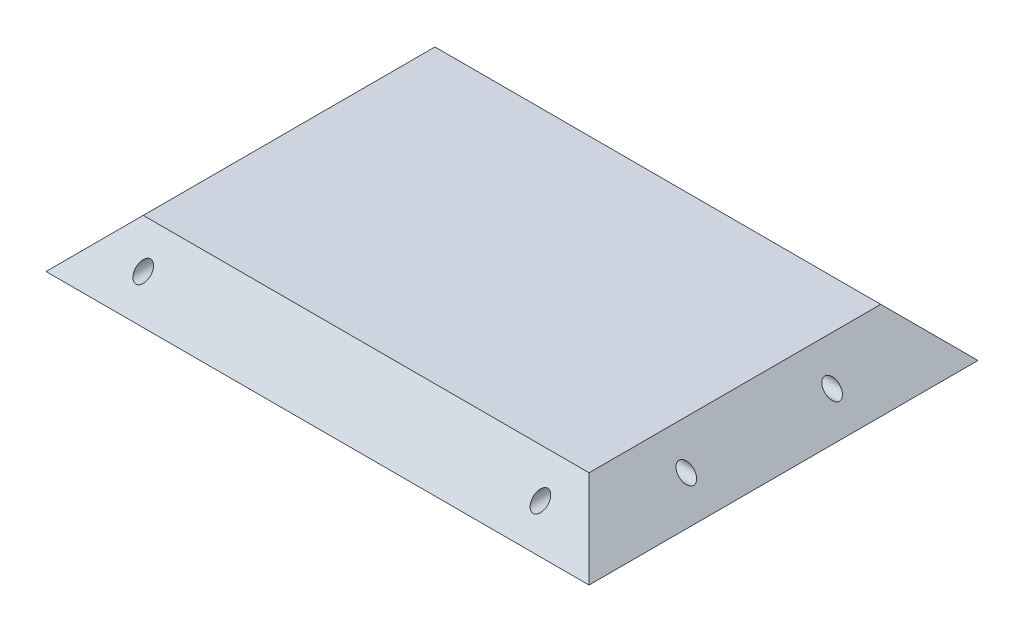
ISO-10303-21;
HEADER;
FILE_DESCRIPTION(('STEP AP214'),'2;1');
FILE_NAME('part.step','',(''),(''),'','','');
FILE_SCHEMA(('AUTOMOTIVE_DESIGN { 1 0 10303 214 1 1 1 1 }'));
ENDSEC;
DATA;
#1=APPLICATION_CONTEXT('core data for automotive mechanical design processes');
#2=APPLICATION_PROTOCOL_DEFINITION('international standard','automotive_design',2000,#1);
#3=PRODUCT_CONTEXT('',#1,'mechanical');
#4=PRODUCT('Part','Part','',(#3));
#5=PRODUCT_RELATED_PRODUCT_CATEGORY('part','',(#4));
#6=PRODUCT_DEFINITION_FORMATION('','',#4);
#7=PRODUCT_DEFINITION_CONTEXT('part definition',#1,'design');
#8=PRODUCT_DEFINITION('design','',#6,#7);
#9=PRODUCT_DEFINITION_SHAPE('','',#8);
#10=(LENGTH_UNIT() NAMED_UNIT(*) SI_UNIT(.MILLI.,.METRE.));
#11=(NAMED_UNIT(*) PLANE_ANGLE_UNIT() SI_UNIT($,.RADIAN.));
#12=(NAMED_UNIT(*) SI_UNIT($,.STERADIAN.) SOLID_ANGLE_UNIT());
#13=UNCERTAINTY_MEASURE_WITH_UNIT(LENGTH_MEASURE(1.E-05),#10,'distance_accuracy_value','');
#14=(GEOMETRIC_REPRESENTATION_CONTEXT(3) GLOBAL_UNCERTAINTY_ASSIGNED_CONTEXT((#13)) GLOBAL_UNIT_ASSIGNED_CONTEXT((#10,
#11,#12)) REPRESENTATION_CONTEXT('',''));
#15=CARTESIAN_POINT('',(0.,0.,0.));
#16=DIRECTION('',(0.,0.,1.));
#17=DIRECTION('',(1.,0.,0.));
#18=AXIS2_PLACEMENT_3D('',#15,#16,#17);
#19=CARTESIAN_POINT('',(-27.925,27.925,0.));
#20=DIRECTION('',(0.707106781186547,-0.707106781186547,0.));
#21=DIRECTION('',(0.707106781186548,0.707106781186547,0.));
#22=AXIS2_PLACEMENT_3D('',#19,#20,#21);
#23=PLANE('',#22);
#24=DIRECTION('',(0.577350269189626,0.577350269189626,-0.577350269189626));
#25=VECTOR('',#24,1.);
#26=CARTESIAN_POINT('',(-55.85,0.,40.));
#27=LINE('',#26,#25);
#28=CARTESIAN_POINT('',(-55.85,0.,40.));
#29=VERTEX_POINT('',#28);
#30=CARTESIAN_POINT('',(-45.85,10.,30.));
#31=VERTEX_POINT('',#30);
#32=EDGE_CURVE('E307',#29,#31,#27,.T.);
#33=ORIENTED_EDGE('',*,*,#32,.T.);
#34=DIRECTION('',(0.,0.,1.));
#35=VECTOR('',#34,1.);
#36=CARTESIAN_POINT('',(-45.85,10.,-30.));
#37=LINE('',#36,#35);
#38=CARTESIAN_POINT('',(-45.85,10.,-30.));
#39=VERTEX_POINT('',#38);
#40=EDGE_CURVE('E57',#39,#31,#37,.T.);
#41=ORIENTED_EDGE('',*,*,#40,.F.);
#42=DIRECTION('',(0.577350269189626,0.577350269189626,0.577350269189626));
#43=VECTOR('',#42,1.);
#44=CARTESIAN_POINT('',(-55.85,0.,-40.));
#45=LINE('',#44,#43);
#46=CARTESIAN_POINT('',(-55.85,0.,-40.));
#47=VERTEX_POINT('',#46);
#48=EDGE_CURVE('E394',#47,#39,#45,.T.);
#49=ORIENTED_EDGE('',*,*,#48,.F.);
#50=DIRECTION('',(0.,0.,1.));
#51=VECTOR('',#50,1.);
#52=CARTESIAN_POINT('',(-55.85,0.,40.));
#53=LINE('',#52,#51);
#54=EDGE_CURVE('E391',#47,#29,#53,.T.);
#55=ORIENTED_EDGE('',*,*,#54,.T.);
#56=EDGE_LOOP('',(#33,#41,#49,#55));
#57=FACE_BOUND('',#56,.T.);
#58=CARTESIAN_POINT('',(-50.85,5.,15.));
#59=DIRECTION('',(0.707106781186547,-0.707106781186547,0.));
#60=DIRECTION('',(-0.707106781186548,-0.707106781186547,0.));
#61=AXIS2_PLACEMENT_3D('',#58,#59,#60);
#62=ELLIPSE('',#61,2.12132034355964,1.5);
#63=CARTESIAN_POINT('',(-52.35,3.5,15.));
#64=VERTEX_POINT('',#63);
#65=EDGE_CURVE('E270',#64,#64,#62,.F.);
#66=ORIENTED_EDGE('',*,*,#65,.F.);
#67=EDGE_LOOP('',(#66));
#68=FACE_BOUND('',#67,.T.);
#69=CARTESIAN_POINT('',(-50.85,5.,-15.));
#70=DIRECTION('',(0.707106781186547,-0.707106781186547,0.));
#71=DIRECTION('',(-0.707106781186548,-0.707106781186547,0.));
#72=AXIS2_PLACEMENT_3D('',#69,#70,#71);
#73=ELLIPSE('',#72,2.12132034355964,1.5);
#74=CARTESIAN_POINT('',(-52.35,3.5,-15.));
#75=VERTEX_POINT('',#74);
#76=EDGE_CURVE('E52',#75,#75,#73,.T.);
#77=ORIENTED_EDGE('',*,*,#76,.T.);
#78=EDGE_LOOP('',(#77));
#79=FACE_BOUND('',#78,.T.);
#80=ADVANCED_FACE('F47',(#57,#68,#79),#23,.F.);
#81=CARTESIAN_POINT('',(27.925,27.925,0.));
#82=DIRECTION('',(-0.707106781186547,-0.707106781186547,0.));
#83=DIRECTION('',(0.707106781186548,-0.707106781186547,0.));
#84=AXIS2_PLACEMENT_3D('',#81,#82,#83);
#85=PLANE('',#84);
#86=CARTESIAN_POINT('',(50.85,5.,15.));
#87=DIRECTION('',(-0.707106781186547,-0.707106781186547,0.));
#88=DIRECTION('',(0.707106781186548,-0.707106781186547,0.));
#89=AXIS2_PLACEMENT_3D('',#86,#87,#88);
#90=ELLIPSE('',#89,2.12132034355964,1.5);
#91=CARTESIAN_POINT('',(52.35,3.5,15.));
#92=VERTEX_POINT('',#91);
#93=EDGE_CURVE('E276',#92,#92,#90,.T.);
#94=ORIENTED_EDGE('',*,*,#93,.T.);
#95=EDGE_LOOP('',(#94));
#96=FACE_BOUND('',#95,.T.);
#97=DIRECTION('',(-0.577350269189626,0.577350269189626,0.577350269189626));
#98=VECTOR('',#97,1.);
#99=CARTESIAN_POINT('',(55.85,0.,-40.));
#100=LINE('',#99,#98);
#101=CARTESIAN_POINT('',(55.85,0.,-40.));
#102=VERTEX_POINT('',#101);
#103=CARTESIAN_POINT('',(45.85,10.,-30.));
#104=VERTEX_POINT('',#103);
#105=EDGE_CURVE('E410',#102,#104,#100,.T.);
#106=ORIENTED_EDGE('',*,*,#105,.T.);
#107=DIRECTION('',(0.,0.,-1.));
#108=VECTOR('',#107,1.);
#109=CARTESIAN_POINT('',(45.85,10.,30.));
#110=LINE('',#109,#108);
#111=CARTESIAN_POINT('',(45.85,10.,30.));
#112=VERTEX_POINT('',#111);
#113=EDGE_CURVE('E338',#112,#104,#110,.T.);
#114=ORIENTED_EDGE('',*,*,#113,.F.);
#115=DIRECTION('',(-0.577350269189626,0.577350269189626,-0.577350269189626));
#116=VECTOR('',#115,1.);
#117=CARTESIAN_POINT('',(55.85,0.,40.));
#118=LINE('',#117,#116);
#119=CARTESIAN_POINT('',(55.85,0.,40.));
#120=VERTEX_POINT('',#119);
#121=EDGE_CURVE('E396',#120,#112,#118,.T.);
#122=ORIENTED_EDGE('',*,*,#121,.F.);
#123=DIRECTION('',(0.,0.,-1.));
#124=VECTOR('',#123,1.);
#125=CARTESIAN_POINT('',(55.85,0.,40.));
#126=LINE('',#125,#124);
#127=EDGE_CURVE('E422',#120,#102,#126,.T.);
#128=ORIENTED_EDGE('',*,*,#127,.T.);
#129=EDGE_LOOP('',(#106,#114,#122,#128));
#130=FACE_BOUND('',#129,.T.);
#131=CARTESIAN_POINT('',(50.85,5.,-15.));
#132=DIRECTION('',(-0.707106781186547,-0.707106781186547,0.));
#133=DIRECTION('',(0.707106781186548,-0.707106781186547,0.));
#134=AXIS2_PLACEMENT_3D('',#131,#132,#133);
#135=ELLIPSE('',#134,2.12132034355964,1.5);
#136=CARTESIAN_POINT('',(52.35,3.5,-15.));
#137=VERTEX_POINT('',#136);
#138=EDGE_CURVE('E287',#137,#137,#135,.F.);
#139=ORIENTED_EDGE('',*,*,#138,.F.);
#140=EDGE_LOOP('',(#139));
#141=FACE_BOUND('',#140,.T.);
#142=ADVANCED_FACE('F321',(#96,#130,#141),#85,.F.);
#143=CARTESIAN_POINT('',(0.,20.,-20.));
#144=DIRECTION('',(0.,-0.707106781186547,0.707106781186547));
#145=DIRECTION('',(0.,-0.707106781186547,-0.707106781186548));
#146=AXIS2_PLACEMENT_3D('',#143,#144,#145);
#147=PLANE('',#146);
#148=CARTESIAN_POINT('',(-40.85,4.99999999999999,-35.));
#149=DIRECTION('',(0.,-0.707106781186547,0.707106781186547));
#150=DIRECTION('',(0.,-0.707106781186547,-0.707106781186548));
#151=AXIS2_PLACEMENT_3D('',#148,#149,#150);
#152=ELLIPSE('',#151,2.12132034355965,1.5);
#153=CARTESIAN_POINT('',(-40.85,3.49999999999999,-36.5));
#154=VERTEX_POINT('',#153);
#155=EDGE_CURVE('E283',#154,#154,#152,.T.);
#156=ORIENTED_EDGE('',*,*,#155,.T.);
#157=EDGE_LOOP('',(#156));
#158=FACE_BOUND('',#157,.T.);
#159=ORIENTED_EDGE('',*,*,#48,.T.);
#160=DIRECTION('',(-1.,0.,0.));
#161=VECTOR('',#160,1.);
#162=CARTESIAN_POINT('',(45.85,10.,-30.));
#163=LINE('',#162,#161);
#164=EDGE_CURVE('E352',#104,#39,#163,.T.);
#165=ORIENTED_EDGE('',*,*,#164,.F.);
#166=ORIENTED_EDGE('',*,*,#105,.F.);
#167=DIRECTION('',(-1.,0.,0.));
#168=VECTOR('',#167,1.);
#169=CARTESIAN_POINT('',(-55.85,0.,-40.));
#170=LINE('',#169,#168);
#171=EDGE_CURVE('E407',#102,#47,#170,.T.);
#172=ORIENTED_EDGE('',*,*,#171,.T.);
#173=EDGE_LOOP('',(#159,#165,#166,#172));
#174=FACE_BOUND('',#173,.T.);
#175=CARTESIAN_POINT('',(40.85,5.,-35.));
#176=DIRECTION('',(0.,-0.707106781186547,0.707106781186547));
#177=DIRECTION('',(0.,-0.707106781186547,-0.707106781186548));
#178=AXIS2_PLACEMENT_3D('',#175,#176,#177);
#179=ELLIPSE('',#178,2.12132034355965,1.5);
#180=CARTESIAN_POINT('',(40.85,3.5,-36.5));
#181=VERTEX_POINT('',#180);
#182=EDGE_CURVE('E295',#181,#181,#179,.F.);
#183=ORIENTED_EDGE('',*,*,#182,.F.);
#184=EDGE_LOOP('',(#183));
#185=FACE_BOUND('',#184,.T.);
#186=ADVANCED_FACE('F318',(#158,#174,#185),#147,.F.);
#187=CARTESIAN_POINT('',(0.,20.,20.));
#188=DIRECTION('',(0.,-0.707106781186547,-0.707106781186547));
#189=DIRECTION('',(0.,0.707106781186547,-0.707106781186548));
#190=AXIS2_PLACEMENT_3D('',#187,#188,#189);
#191=PLANE('',#190);
#192=ORIENTED_EDGE('',*,*,#121,.T.);
#193=DIRECTION('',(1.,0.,0.));
#194=VECTOR('',#193,1.);
#195=CARTESIAN_POINT('',(-45.85,10.,30.));
#196=LINE('',#195,#194);
#197=EDGE_CURVE('E12',#31,#112,#196,.T.);
#198=ORIENTED_EDGE('',*,*,#197,.F.);
#199=ORIENTED_EDGE('',*,*,#32,.F.);
#200=DIRECTION('',(1.,0.,0.));
#201=VECTOR('',#200,1.);
#202=CARTESIAN_POINT('',(-55.85,0.,40.));
#203=LINE('',#202,#201);
#204=EDGE_CURVE('E301',#29,#120,#203,.T.);
#205=ORIENTED_EDGE('',*,*,#204,.T.);
#206=EDGE_LOOP('',(#192,#198,#199,#205));
#207=FACE_BOUND('',#206,.T.);
#208=CARTESIAN_POINT('',(-40.85,4.99999999999999,35.));
#209=DIRECTION('',(0.,-0.707106781186547,-0.707106781186547));
#210=DIRECTION('',(0.,-0.707106781186547,0.707106781186548));
#211=AXIS2_PLACEMENT_3D('',#208,#209,#210);
#212=ELLIPSE('',#211,2.12132034355965,1.5);
#213=CARTESIAN_POINT('',(-40.85,3.49999999999999,36.5));
#214=VERTEX_POINT('',#213);
#215=EDGE_CURVE('E291',#214,#214,#212,.F.);
#216=ORIENTED_EDGE('',*,*,#215,.F.);
#217=EDGE_LOOP('',(#216));
#218=FACE_BOUND('',#217,.T.);
#219=CARTESIAN_POINT('',(40.85,5.,35.));
#220=DIRECTION('',(0.,-0.707106781186547,-0.707106781186547));
#221=DIRECTION('',(0.,-0.707106781186547,0.707106781186548));
#222=AXIS2_PLACEMENT_3D('',#219,#220,#221);
#223=ELLIPSE('',#222,2.12132034355965,1.5);
#224=CARTESIAN_POINT('',(40.85,3.5,36.5));
#225=VERTEX_POINT('',#224);
#226=EDGE_CURVE('E517',#225,#225,#223,.T.);
#227=ORIENTED_EDGE('',*,*,#226,.T.);
#228=EDGE_LOOP('',(#227));
#229=FACE_BOUND('',#228,.T.);
#230=ADVANCED_FACE('F309',(#207,#218,#229),#191,.F.);
#231=CARTESIAN_POINT('',(0.,10.,0.));
#232=DIRECTION('',(0.,1.,0.));
#233=DIRECTION('',(0.,0.,1.));
#234=AXIS2_PLACEMENT_3D('',#231,#232,#233);
#235=PLANE('',#234);
#236=ORIENTED_EDGE('',*,*,#113,.T.);
#237=ORIENTED_EDGE('',*,*,#164,.T.);
#238=ORIENTED_EDGE('',*,*,#40,.T.);
#239=ORIENTED_EDGE('',*,*,#197,.T.);
#240=EDGE_LOOP('',(#236,#237,#238,#239));
#241=FACE_BOUND('',#240,.T.);
#242=ADVANCED_FACE('F49',(#241),#235,.T.);
#243=CARTESIAN_POINT('',(0.,0.,0.));
#244=DIRECTION('',(0.,-1.,0.));
#245=DIRECTION('',(0.,0.,-1.));
#246=AXIS2_PLACEMENT_3D('',#243,#244,#245);
#247=PLANE('',#246);
#248=DIRECTION('',(-1.,0.,0.));
#249=VECTOR('',#248,1.);
#250=CARTESIAN_POINT('',(-39.85,0.,-5.));
#251=LINE('',#250,#249);
#252=CARTESIAN_POINT('',(-39.35,0.,-5.));
#253=VERTEX_POINT('',#252);
#254=CARTESIAN_POINT('',(-39.85,0.,-5.));
#255=VERTEX_POINT('',#254);
#256=EDGE_CURVE('E65',#253,#255,#251,.T.);
#257=ORIENTED_EDGE('',*,*,#256,.F.);
#258=DIRECTION('',(0.707106781186547,0.,0.707106781186547));
#259=VECTOR('',#258,1.);
#260=CARTESIAN_POINT('',(-39.35,0.,-5.));
#261=LINE('',#260,#259);
#262=CARTESIAN_POINT('',(-40.35,0.,-6.));
#263=VERTEX_POINT('',#262);
#264=EDGE_CURVE('E185',#263,#253,#261,.T.);
#265=ORIENTED_EDGE('',*,*,#264,.F.);
#266=DIRECTION('',(0.707106781186547,0.,-0.707106781186547));
#267=VECTOR('',#266,1.);
#268=CARTESIAN_POINT('',(-40.35,0.,-6.));
#269=LINE('',#268,#267);
#270=CARTESIAN_POINT('',(-41.35,0.,-5.));
#271=VERTEX_POINT('',#270);
#272=EDGE_CURVE('E188',#271,#263,#269,.T.);
#273=ORIENTED_EDGE('',*,*,#272,.F.);
#274=DIRECTION('',(-1.,0.,0.));
#275=VECTOR('',#274,1.);
#276=CARTESIAN_POINT('',(-41.35,0.,-5.));
#277=LINE('',#276,#275);
#278=CARTESIAN_POINT('',(-40.85,0.,-5.));
#279=VERTEX_POINT('',#278);
#280=EDGE_CURVE('E240',#279,#271,#277,.T.);
#281=ORIENTED_EDGE('',*,*,#280,.F.);
#282=DIRECTION('',(0.,0.,-1.));
#283=VECTOR('',#282,1.);
#284=CARTESIAN_POINT('',(-40.85,0.,-5.));
#285=LINE('',#284,#283);
#286=CARTESIAN_POINT('',(-40.85,0.,25.));
#287=VERTEX_POINT('',#286);
#288=EDGE_CURVE('E237',#287,#279,#285,.T.);
#289=ORIENTED_EDGE('',*,*,#288,.F.);
#290=DIRECTION('',(-1.,0.,0.));
#291=VECTOR('',#290,1.);
#292=CARTESIAN_POINT('',(-10.85,0.,25.));
#293=LINE('',#292,#291);
#294=CARTESIAN_POINT('',(-10.85,0.,25.));
#295=VERTEX_POINT('',#294);
#296=EDGE_CURVE('E234',#295,#287,#293,.T.);
#297=ORIENTED_EDGE('',*,*,#296,.F.);
#298=DIRECTION('',(0.,0.,-1.));
#299=VECTOR('',#298,1.);
#300=CARTESIAN_POINT('',(-10.85,0.,25.5));
#301=LINE('',#300,#299);
#302=CARTESIAN_POINT('',(-10.85,0.,25.5));
#303=VERTEX_POINT('',#302);
#304=EDGE_CURVE('E231',#303,#295,#301,.T.);
#305=ORIENTED_EDGE('',*,*,#304,.F.);
#306=DIRECTION('',(-0.707106781186549,0.,0.707106781186546));
#307=VECTOR('',#306,1.);
#308=CARTESIAN_POINT('',(-9.85,0.,24.5));
#309=LINE('',#308,#307);
#310=CARTESIAN_POINT('',(-9.85,0.,24.5));
#311=VERTEX_POINT('',#310);
#312=EDGE_CURVE('E228',#311,#303,#309,.T.);
#313=ORIENTED_EDGE('',*,*,#312,.F.);
#314=DIRECTION('',(0.707106781186546,0.,0.707106781186549));
#315=VECTOR('',#314,1.);
#316=CARTESIAN_POINT('',(-10.85,0.,23.5));
#317=LINE('',#316,#315);
#318=CARTESIAN_POINT('',(-10.85,0.,23.5));
#319=VERTEX_POINT('',#318);
#320=EDGE_CURVE('E225',#319,#311,#317,.T.);
#321=ORIENTED_EDGE('',*,*,#320,.F.);
#322=DIRECTION('',(0.,0.,-1.));
#323=VECTOR('',#322,1.);
#324=CARTESIAN_POINT('',(-10.85,0.,24.));
#325=LINE('',#324,#323);
#326=CARTESIAN_POINT('',(-10.85,0.,24.));
#327=VERTEX_POINT('',#326);
#328=EDGE_CURVE('E222',#327,#319,#325,.T.);
#329=ORIENTED_EDGE('',*,*,#328,.F.);
#330=DIRECTION('',(1.,0.,0.));
#331=VECTOR('',#330,1.);
#332=CARTESIAN_POINT('',(-39.85,0.,24.));
#333=LINE('',#332,#331);
#334=CARTESIAN_POINT('',(-39.85,0.,24.));
#335=VERTEX_POINT('',#334);
#336=EDGE_CURVE('E219',#335,#327,#333,.T.);
#337=ORIENTED_EDGE('',*,*,#336,.F.);
#338=DIRECTION('',(0.,0.,1.));
#339=VECTOR('',#338,1.);
#340=CARTESIAN_POINT('',(-39.85,0.,-5.));
#341=LINE('',#340,#339);
#342=EDGE_CURVE('E217',#255,#335,#341,.T.);
#343=ORIENTED_EDGE('',*,*,#342,.F.);
#344=EDGE_LOOP('',(#257,#265,#273,#281,#289,#297,#305,#313,#321,#329,#337,#343));
#345=FACE_BOUND('',#344,.T.);
#346=ORIENTED_EDGE('',*,*,#127,.F.);
#347=ORIENTED_EDGE('',*,*,#204,.F.);
#348=ORIENTED_EDGE('',*,*,#54,.F.);
#349=ORIENTED_EDGE('',*,*,#171,.F.);
#350=EDGE_LOOP('',(#346,#347,#348,#349));
#351=FACE_BOUND('',#350,.T.);
#352=ADVANCED_FACE('F377',(#345,#351),#247,.T.);
#353=CARTESIAN_POINT('',(-40.85,4.99999999999999,20.));
#354=DIRECTION('',(0.,0.,1.));
#355=DIRECTION('',(1.,0.,0.));
#356=AXIS2_PLACEMENT_3D('',#353,#354,#355);
#357=CYLINDRICAL_SURFACE('',#356,1.5);
#358=CARTESIAN_POINT('',(-40.85,4.99999999999999,20.));
#359=DIRECTION('',(0.,0.,-1.));
#360=DIRECTION('',(-1.,0.,0.));
#361=AXIS2_PLACEMENT_3D('',#358,#359,#360);
#362=CIRCLE('',#361,1.5);
#363=CARTESIAN_POINT('',(-42.35,4.99999999999999,20.));
#364=VERTEX_POINT('',#363);
#365=EDGE_CURVE('E292',#364,#364,#362,.T.);
#366=ORIENTED_EDGE('',*,*,#365,.T.);
#367=EDGE_LOOP('',(#366));
#368=FACE_BOUND('',#367,.T.);
#369=ORIENTED_EDGE('',*,*,#215,.T.);
#370=EDGE_LOOP('',(#369));
#371=FACE_BOUND('',#370,.T.);
#372=ADVANCED_FACE('F506',(#368,#371),#357,.F.);
#373=CARTESIAN_POINT('',(-40.85,4.99999999999999,20.));
#374=DIRECTION('',(0.,0.,-1.));
#375=DIRECTION('',(-1.,0.,0.));
#376=AXIS2_PLACEMENT_3D('',#373,#374,#375);
#377=PLANE('',#376);
#378=ORIENTED_EDGE('',*,*,#365,.F.);
#379=EDGE_LOOP('',(#378));
#380=FACE_BOUND('',#379,.T.);
#381=ADVANCED_FACE('F504',(#380),#377,.F.);
#382=CARTESIAN_POINT('',(40.85,5.,20.));
#383=DIRECTION('',(0.,0.,1.));
#384=DIRECTION('',(1.,0.,0.));
#385=AXIS2_PLACEMENT_3D('',#382,#383,#384);
#386=CYLINDRICAL_SURFACE('',#385,1.5);
#387=CARTESIAN_POINT('',(40.85,5.,20.));
#388=DIRECTION('',(0.,0.,1.));
#389=DIRECTION('',(1.,0.,0.));
#390=AXIS2_PLACEMENT_3D('',#387,#388,#389);
#391=CIRCLE('',#390,1.5);
#392=CARTESIAN_POINT('',(42.35,5.,20.));
#393=VERTEX_POINT('',#392);
#394=EDGE_CURVE('E288',#393,#393,#391,.T.);
#395=ORIENTED_EDGE('',*,*,#394,.F.);
#396=EDGE_LOOP('',(#395));
#397=FACE_BOUND('',#396,.T.);
#398=ORIENTED_EDGE('',*,*,#226,.F.);
#399=EDGE_LOOP('',(#398));
#400=FACE_BOUND('',#399,.T.);
#401=ADVANCED_FACE('F500',(#397,#400),#386,.F.);
#402=CARTESIAN_POINT('',(40.85,5.,20.));
#403=DIRECTION('',(0.,0.,1.));
#404=DIRECTION('',(1.,0.,0.));
#405=AXIS2_PLACEMENT_3D('',#402,#403,#404);
#406=PLANE('',#405);
#407=ORIENTED_EDGE('',*,*,#394,.T.);
#408=EDGE_LOOP('',(#407));
#409=FACE_BOUND('',#408,.T.);
#410=ADVANCED_FACE('F496',(#409),#406,.T.);
#411=CARTESIAN_POINT('',(-40.85,4.99999999999999,-20.));
#412=DIRECTION('',(0.,0.,-1.));
#413=DIRECTION('',(-1.,0.,0.));
#414=AXIS2_PLACEMENT_3D('',#411,#412,#413);
#415=CYLINDRICAL_SURFACE('',#414,1.5);
#416=CARTESIAN_POINT('',(-40.85,4.99999999999999,-20.));
#417=DIRECTION('',(0.,0.,-1.));
#418=DIRECTION('',(-1.,0.,0.));
#419=AXIS2_PLACEMENT_3D('',#416,#417,#418);
#420=CIRCLE('',#419,1.5);
#421=CARTESIAN_POINT('',(-42.35,4.99999999999999,-20.));
#422=VERTEX_POINT('',#421);
#423=EDGE_CURVE('E284',#422,#422,#420,.T.);
#424=ORIENTED_EDGE('',*,*,#423,.F.);
#425=EDGE_LOOP('',(#424));
#426=FACE_BOUND('',#425,.T.);
#427=ORIENTED_EDGE('',*,*,#155,.F.);
#428=EDGE_LOOP('',(#427));
#429=FACE_BOUND('',#428,.T.);
#430=ADVANCED_FACE('F492',(#426,#429),#415,.F.);
#431=CARTESIAN_POINT('',(-40.85,4.99999999999999,-20.));
#432=DIRECTION('',(0.,0.,1.));
#433=DIRECTION('',(-1.,0.,0.));
#434=AXIS2_PLACEMENT_3D('',#431,#432,#433);
#435=PLANE('',#434);
#436=ORIENTED_EDGE('',*,*,#423,.T.);
#437=EDGE_LOOP('',(#436));
#438=FACE_BOUND('',#437,.T.);
#439=ADVANCED_FACE('F488',(#438),#435,.F.);
#440=CARTESIAN_POINT('',(40.85,5.,-20.));
#441=DIRECTION('',(0.,0.,-1.));
#442=DIRECTION('',(-1.,0.,0.));
#443=AXIS2_PLACEMENT_3D('',#440,#441,#442);
#444=CYLINDRICAL_SURFACE('',#443,1.5);
#445=CARTESIAN_POINT('',(40.85,5.,-20.));
#446=DIRECTION('',(0.,0.,1.));
#447=DIRECTION('',(1.,0.,0.));
#448=AXIS2_PLACEMENT_3D('',#445,#446,#447);
#449=CIRCLE('',#448,1.5);
#450=CARTESIAN_POINT('',(42.35,5.,-20.));
#451=VERTEX_POINT('',#450);
#452=EDGE_CURVE('E280',#451,#451,#449,.T.);
#453=ORIENTED_EDGE('',*,*,#452,.T.);
#454=EDGE_LOOP('',(#453));
#455=FACE_BOUND('',#454,.T.);
#456=ORIENTED_EDGE('',*,*,#182,.T.);
#457=EDGE_LOOP('',(#456));
#458=FACE_BOUND('',#457,.T.);
#459=ADVANCED_FACE('F484',(#455,#458),#444,.F.);
#460=CARTESIAN_POINT('',(40.85,5.,-20.));
#461=DIRECTION('',(0.,0.,-1.));
#462=DIRECTION('',(1.,0.,0.));
#463=AXIS2_PLACEMENT_3D('',#460,#461,#462);
#464=PLANE('',#463);
#465=ORIENTED_EDGE('',*,*,#452,.F.);
#466=EDGE_LOOP('',(#465));
#467=FACE_BOUND('',#466,.T.);
#468=ADVANCED_FACE('F477',(#467),#464,.T.);
#469=CARTESIAN_POINT('',(35.85,5.,15.));
#470=DIRECTION('',(1.,0.,0.));
#471=DIRECTION('',(0.,0.,-1.));
#472=AXIS2_PLACEMENT_3D('',#469,#470,#471);
#473=CYLINDRICAL_SURFACE('',#472,1.5);
#474=CARTESIAN_POINT('',(35.85,5.,15.));
#475=DIRECTION('',(1.,0.,0.));
#476=DIRECTION('',(0.,0.,-1.));
#477=AXIS2_PLACEMENT_3D('',#474,#475,#476);
#478=CIRCLE('',#477,1.5);
#479=CARTESIAN_POINT('',(35.85,5.,13.5));
#480=VERTEX_POINT('',#479);
#481=EDGE_CURVE('E277',#480,#480,#478,.T.);
#482=ORIENTED_EDGE('',*,*,#481,.F.);
#483=EDGE_LOOP('',(#482));
#484=FACE_BOUND('',#483,.T.);
#485=ORIENTED_EDGE('',*,*,#93,.F.);
#486=EDGE_LOOP('',(#485));
#487=FACE_BOUND('',#486,.T.);
#488=ADVANCED_FACE('F474',(#484,#487),#473,.F.);
#489=CARTESIAN_POINT('',(35.85,5.,15.));
#490=DIRECTION('',(1.,0.,0.));
#491=DIRECTION('',(0.,0.,-1.));
#492=AXIS2_PLACEMENT_3D('',#489,#490,#491);
#493=PLANE('',#492);
#494=ORIENTED_EDGE('',*,*,#481,.T.);
#495=EDGE_LOOP('',(#494));
#496=FACE_BOUND('',#495,.T.);
#497=ADVANCED_FACE('F472',(#496),#493,.T.);
#498=CARTESIAN_POINT('',(35.85,5.,-15.));
#499=DIRECTION('',(1.,0.,0.));
#500=DIRECTION('',(0.,0.,-1.));
#501=AXIS2_PLACEMENT_3D('',#498,#499,#500);
#502=CYLINDRICAL_SURFACE('',#501,1.5);
#503=CARTESIAN_POINT('',(35.85,5.,-15.));
#504=DIRECTION('',(-1.,0.,0.));
#505=DIRECTION('',(0.,0.,1.));
#506=AXIS2_PLACEMENT_3D('',#503,#504,#505);
#507=CIRCLE('',#506,1.5);
#508=CARTESIAN_POINT('',(35.85,5.,-13.5));
#509=VERTEX_POINT('',#508);
#510=EDGE_CURVE('E273',#509,#509,#507,.T.);
#511=ORIENTED_EDGE('',*,*,#510,.T.);
#512=EDGE_LOOP('',(#511));
#513=FACE_BOUND('',#512,.T.);
#514=ORIENTED_EDGE('',*,*,#138,.T.);
#515=EDGE_LOOP('',(#514));
#516=FACE_BOUND('',#515,.T.);
#517=ADVANCED_FACE('F468',(#513,#516),#502,.F.);
#518=CARTESIAN_POINT('',(35.85,5.,-15.));
#519=DIRECTION('',(-1.,0.,0.));
#520=DIRECTION('',(0.,0.,1.));
#521=AXIS2_PLACEMENT_3D('',#518,#519,#520);
#522=PLANE('',#521);
#523=ORIENTED_EDGE('',*,*,#510,.F.);
#524=EDGE_LOOP('',(#523));
#525=FACE_BOUND('',#524,.T.);
#526=ADVANCED_FACE('F464',(#525),#522,.F.);
#527=CARTESIAN_POINT('',(-35.85,5.,15.));
#528=DIRECTION('',(-1.,0.,0.));
#529=DIRECTION('',(0.,0.,1.));
#530=AXIS2_PLACEMENT_3D('',#527,#528,#529);
#531=CYLINDRICAL_SURFACE('',#530,1.5);
#532=CARTESIAN_POINT('',(-35.85,5.,15.));
#533=DIRECTION('',(1.,0.,0.));
#534=DIRECTION('',(0.,0.,-1.));
#535=AXIS2_PLACEMENT_3D('',#532,#533,#534);
#536=CIRCLE('',#535,1.5);
#537=CARTESIAN_POINT('',(-35.85,5.,13.5));
#538=VERTEX_POINT('',#537);
#539=EDGE_CURVE('E247',#538,#538,#536,.T.);
#540=ORIENTED_EDGE('',*,*,#539,.T.);
#541=EDGE_LOOP('',(#540));
#542=FACE_BOUND('',#541,.T.);
#543=ORIENTED_EDGE('',*,*,#65,.T.);
#544=EDGE_LOOP('',(#543));
#545=FACE_BOUND('',#544,.T.);
#546=ADVANCED_FACE('F456',(#542,#545),#531,.F.);
#547=CARTESIAN_POINT('',(-35.85,5.,15.));
#548=DIRECTION('',(-1.,0.,0.));
#549=DIRECTION('',(0.,0.,-1.));
#550=AXIS2_PLACEMENT_3D('',#547,#548,#549);
#551=PLANE('',#550);
#552=ORIENTED_EDGE('',*,*,#539,.F.);
#553=EDGE_LOOP('',(#552));
#554=FACE_BOUND('',#553,.T.);
#555=ADVANCED_FACE('F447',(#554),#551,.T.);
#556=CARTESIAN_POINT('',(-35.85,5.,-15.));
#557=DIRECTION('',(-1.,0.,0.));
#558=DIRECTION('',(0.,0.,1.));
#559=AXIS2_PLACEMENT_3D('',#556,#557,#558);
#560=CYLINDRICAL_SURFACE('',#559,1.5);
#561=CARTESIAN_POINT('',(-35.85,5.,-15.));
#562=DIRECTION('',(-1.,0.,0.));
#563=DIRECTION('',(0.,0.,1.));
#564=AXIS2_PLACEMENT_3D('',#561,#562,#563);
#565=CIRCLE('',#564,1.5);
#566=CARTESIAN_POINT('',(-35.85,5.,-13.5));
#567=VERTEX_POINT('',#566);
#568=EDGE_CURVE('E267',#567,#567,#565,.T.);
#569=ORIENTED_EDGE('',*,*,#568,.F.);
#570=EDGE_LOOP('',(#569));
#571=FACE_BOUND('',#570,.T.);
#572=ORIENTED_EDGE('',*,*,#76,.F.);
#573=EDGE_LOOP('',(#572));
#574=FACE_BOUND('',#573,.T.);
#575=ADVANCED_FACE('F444',(#571,#574),#560,.F.);
#576=CARTESIAN_POINT('',(-35.85,5.,-15.));
#577=DIRECTION('',(1.,0.,0.));
#578=DIRECTION('',(0.,0.,1.));
#579=AXIS2_PLACEMENT_3D('',#576,#577,#578);
#580=PLANE('',#579);
#581=ORIENTED_EDGE('',*,*,#568,.T.);
#582=EDGE_LOOP('',(#581));
#583=FACE_BOUND('',#582,.T.);
#584=ADVANCED_FACE('F446',(#583),#580,.F.);
#585=CARTESIAN_POINT('',(-39.85,0.6,-5.));
#586=DIRECTION('',(0.,0.,1.));
#587=DIRECTION('',(1.,0.,0.));
#588=AXIS2_PLACEMENT_3D('',#585,#586,#587);
#589=PLANE('',#588);
#590=ORIENTED_EDGE('',*,*,#256,.T.);
#591=DIRECTION('',(0.,-1.,0.));
#592=VECTOR('',#591,1.);
#593=CARTESIAN_POINT('',(-39.85,0.6,-5.));
#594=LINE('',#593,#592);
#595=CARTESIAN_POINT('',(-39.85,0.6,-5.));
#596=VERTEX_POINT('',#595);
#597=EDGE_CURVE('E162',#596,#255,#594,.T.);
#598=ORIENTED_EDGE('',*,*,#597,.F.);
#599=DIRECTION('',(-1.,0.,0.));
#600=VECTOR('',#599,1.);
#601=CARTESIAN_POINT('',(-39.85,0.6,-5.));
#602=LINE('',#601,#600);
#603=CARTESIAN_POINT('',(-39.35,0.6,-5.));
#604=VERTEX_POINT('',#603);
#605=EDGE_CURVE('E166',#604,#596,#602,.T.);
#606=ORIENTED_EDGE('',*,*,#605,.F.);
#607=DIRECTION('',(0.,-1.,0.));
#608=VECTOR('',#607,1.);
#609=CARTESIAN_POINT('',(-39.35,0.6,-5.));
#610=LINE('',#609,#608);
#611=EDGE_CURVE('E245',#604,#253,#610,.T.);
#612=ORIENTED_EDGE('',*,*,#611,.T.);
#613=EDGE_LOOP('',(#590,#598,#606,#612));
#614=FACE_BOUND('',#613,.T.);
#615=ADVANCED_FACE('F164',(#614),#589,.F.);
#616=CARTESIAN_POINT('',(-39.35,0.6,-5.));
#617=DIRECTION('',(0.707106781186547,0.,-0.707106781186547));
#618=DIRECTION('',(-0.707106781186548,0.,-0.707106781186548));
#619=AXIS2_PLACEMENT_3D('',#616,#617,#618);
#620=PLANE('',#619);
#621=ORIENTED_EDGE('',*,*,#264,.T.);
#622=ORIENTED_EDGE('',*,*,#611,.F.);
#623=DIRECTION('',(0.707106781186547,0.,0.707106781186547));
#624=VECTOR('',#623,1.);
#625=CARTESIAN_POINT('',(-39.35,0.6,-5.));
#626=LINE('',#625,#624);
#627=CARTESIAN_POINT('',(-40.35,0.6,-6.));
#628=VERTEX_POINT('',#627);
#629=EDGE_CURVE('E172',#628,#604,#626,.T.);
#630=ORIENTED_EDGE('',*,*,#629,.F.);
#631=DIRECTION('',(0.,-1.,0.));
#632=VECTOR('',#631,1.);
#633=CARTESIAN_POINT('',(-40.35,0.6,-6.));
#634=LINE('',#633,#632);
#635=EDGE_CURVE('E248',#628,#263,#634,.T.);
#636=ORIENTED_EDGE('',*,*,#635,.T.);
#637=EDGE_LOOP('',(#621,#622,#630,#636));
#638=FACE_BOUND('',#637,.T.);
#639=ADVANCED_FACE('F643',(#638),#620,.F.);
#640=CARTESIAN_POINT('',(-40.35,0.6,-6.));
#641=DIRECTION('',(-0.707106781186547,0.,-0.707106781186547));
#642=DIRECTION('',(-0.707106781186548,0.,0.707106781186548));
#643=AXIS2_PLACEMENT_3D('',#640,#641,#642);
#644=PLANE('',#643);
#645=ORIENTED_EDGE('',*,*,#272,.T.);
#646=ORIENTED_EDGE('',*,*,#635,.F.);
#647=DIRECTION('',(0.707106781186547,0.,-0.707106781186547));
#648=VECTOR('',#647,1.);
#649=CARTESIAN_POINT('',(-40.35,0.6,-6.));
#650=LINE('',#649,#648);
#651=CARTESIAN_POINT('',(-41.35,0.6,-5.));
#652=VERTEX_POINT('',#651);
#653=EDGE_CURVE('E213',#652,#628,#650,.T.);
#654=ORIENTED_EDGE('',*,*,#653,.F.);
#655=DIRECTION('',(0.,-1.,0.));
#656=VECTOR('',#655,1.);
#657=CARTESIAN_POINT('',(-41.35,0.6,-5.));
#658=LINE('',#657,#656);
#659=EDGE_CURVE('E250',#652,#271,#658,.T.);
#660=ORIENTED_EDGE('',*,*,#659,.T.);
#661=EDGE_LOOP('',(#645,#646,#654,#660));
#662=FACE_BOUND('',#661,.T.);
#663=ADVANCED_FACE('F641',(#662),#644,.F.);
#664=CARTESIAN_POINT('',(-41.35,0.6,-5.));
#665=DIRECTION('',(0.,0.,1.));
#666=DIRECTION('',(1.,0.,0.));
#667=AXIS2_PLACEMENT_3D('',#664,#665,#666);
#668=PLANE('',#667);
#669=ORIENTED_EDGE('',*,*,#280,.T.);
#670=ORIENTED_EDGE('',*,*,#659,.F.);
#671=DIRECTION('',(-1.,0.,0.));
#672=VECTOR('',#671,1.);
#673=CARTESIAN_POINT('',(-41.35,0.6,-5.));
#674=LINE('',#673,#672);
#675=CARTESIAN_POINT('',(-40.85,0.6,-5.));
#676=VERTEX_POINT('',#675);
#677=EDGE_CURVE('E210',#676,#652,#674,.T.);
#678=ORIENTED_EDGE('',*,*,#677,.F.);
#679=DIRECTION('',(0.,-1.,0.));
#680=VECTOR('',#679,1.);
#681=CARTESIAN_POINT('',(-40.85,0.6,-5.));
#682=LINE('',#681,#680);
#683=EDGE_CURVE('E252',#676,#279,#682,.T.);
#684=ORIENTED_EDGE('',*,*,#683,.T.);
#685=EDGE_LOOP('',(#669,#670,#678,#684));
#686=FACE_BOUND('',#685,.T.);
#687=ADVANCED_FACE('F638',(#686),#668,.F.);
#688=CARTESIAN_POINT('',(-40.85,0.6,-5.));
#689=DIRECTION('',(-1.,0.,0.));
#690=DIRECTION('',(0.,0.,1.));
#691=AXIS2_PLACEMENT_3D('',#688,#689,#690);
#692=PLANE('',#691);
#693=ORIENTED_EDGE('',*,*,#288,.T.);
#694=ORIENTED_EDGE('',*,*,#683,.F.);
#695=DIRECTION('',(0.,0.,-1.));
#696=VECTOR('',#695,1.);
#697=CARTESIAN_POINT('',(-40.85,0.6,-5.));
#698=LINE('',#697,#696);
#699=CARTESIAN_POINT('',(-40.85,0.6,25.));
#700=VERTEX_POINT('',#699);
#701=EDGE_CURVE('E207',#700,#676,#698,.T.);
#702=ORIENTED_EDGE('',*,*,#701,.F.);
#703=DIRECTION('',(0.,-1.,0.));
#704=VECTOR('',#703,1.);
#705=CARTESIAN_POINT('',(-40.85,0.6,25.));
#706=LINE('',#705,#704);
#707=EDGE_CURVE('E254',#700,#287,#706,.T.);
#708=ORIENTED_EDGE('',*,*,#707,.T.);
#709=EDGE_LOOP('',(#693,#694,#702,#708));
#710=FACE_BOUND('',#709,.T.);
#711=ADVANCED_FACE('F634',(#710),#692,.F.);
#712=CARTESIAN_POINT('',(-10.85,0.6,25.));
#713=DIRECTION('',(0.,0.,1.));
#714=DIRECTION('',(1.,0.,0.));
#715=AXIS2_PLACEMENT_3D('',#712,#713,#714);
#716=PLANE('',#715);
#717=ORIENTED_EDGE('',*,*,#296,.T.);
#718=ORIENTED_EDGE('',*,*,#707,.F.);
#719=DIRECTION('',(-1.,0.,0.));
#720=VECTOR('',#719,1.);
#721=CARTESIAN_POINT('',(-10.85,0.6,25.));
#722=LINE('',#721,#720);
#723=CARTESIAN_POINT('',(-10.85,0.6,25.));
#724=VERTEX_POINT('',#723);
#725=EDGE_CURVE('E204',#724,#700,#722,.T.);
#726=ORIENTED_EDGE('',*,*,#725,.F.);
#727=DIRECTION('',(0.,-1.,0.));
#728=VECTOR('',#727,1.);
#729=CARTESIAN_POINT('',(-10.85,0.6,25.));
#730=LINE('',#729,#728);
#731=EDGE_CURVE('E256',#724,#295,#730,.T.);
#732=ORIENTED_EDGE('',*,*,#731,.T.);
#733=EDGE_LOOP('',(#717,#718,#726,#732));
#734=FACE_BOUND('',#733,.T.);
#735=ADVANCED_FACE('F630',(#734),#716,.F.);
#736=CARTESIAN_POINT('',(-10.85,0.6,25.5));
#737=DIRECTION('',(-1.,0.,0.));
#738=DIRECTION('',(0.,0.,1.));
#739=AXIS2_PLACEMENT_3D('',#736,#737,#738);
#740=PLANE('',#739);
#741=ORIENTED_EDGE('',*,*,#304,.T.);
#742=ORIENTED_EDGE('',*,*,#731,.F.);
#743=DIRECTION('',(0.,0.,-1.));
#744=VECTOR('',#743,1.);
#745=CARTESIAN_POINT('',(-10.85,0.6,25.5));
#746=LINE('',#745,#744);
#747=CARTESIAN_POINT('',(-10.85,0.6,25.5));
#748=VERTEX_POINT('',#747);
#749=EDGE_CURVE('E201',#748,#724,#746,.T.);
#750=ORIENTED_EDGE('',*,*,#749,.F.);
#751=DIRECTION('',(0.,-1.,0.));
#752=VECTOR('',#751,1.);
#753=CARTESIAN_POINT('',(-10.85,0.6,25.5));
#754=LINE('',#753,#752);
#755=EDGE_CURVE('E258',#748,#303,#754,.T.);
#756=ORIENTED_EDGE('',*,*,#755,.T.);
#757=EDGE_LOOP('',(#741,#742,#750,#756));
#758=FACE_BOUND('',#757,.T.);
#759=ADVANCED_FACE('F626',(#758),#740,.F.);
#760=CARTESIAN_POINT('',(-9.85,0.6,24.5));
#761=DIRECTION('',(0.707106781186546,0.,0.707106781186549));
#762=DIRECTION('',(0.707106781186549,0.,-0.707106781186546));
#763=AXIS2_PLACEMENT_3D('',#760,#761,#762);
#764=PLANE('',#763);
#765=ORIENTED_EDGE('',*,*,#312,.T.);
#766=ORIENTED_EDGE('',*,*,#755,.F.);
#767=DIRECTION('',(-0.707106781186549,0.,0.707106781186546));
#768=VECTOR('',#767,1.);
#769=CARTESIAN_POINT('',(-9.85,0.6,24.5));
#770=LINE('',#769,#768);
#771=CARTESIAN_POINT('',(-9.85,0.6,24.5));
#772=VERTEX_POINT('',#771);
#773=EDGE_CURVE('E198',#772,#748,#770,.T.);
#774=ORIENTED_EDGE('',*,*,#773,.F.);
#775=DIRECTION('',(0.,-1.,0.));
#776=VECTOR('',#775,1.);
#777=CARTESIAN_POINT('',(-9.85,0.6,24.5));
#778=LINE('',#777,#776);
#779=EDGE_CURVE('E260',#772,#311,#778,.T.);
#780=ORIENTED_EDGE('',*,*,#779,.T.);
#781=EDGE_LOOP('',(#765,#766,#774,#780));
#782=FACE_BOUND('',#781,.T.);
#783=ADVANCED_FACE('F622',(#782),#764,.F.);
#784=CARTESIAN_POINT('',(-10.85,0.6,23.5));
#785=DIRECTION('',(0.707106781186549,0.,-0.707106781186546));
#786=DIRECTION('',(-0.707106781186546,0.,-0.707106781186549));
#787=AXIS2_PLACEMENT_3D('',#784,#785,#786);
#788=PLANE('',#787);
#789=ORIENTED_EDGE('',*,*,#320,.T.);
#790=ORIENTED_EDGE('',*,*,#779,.F.);
#791=DIRECTION('',(0.707106781186546,0.,0.707106781186549));
#792=VECTOR('',#791,1.);
#793=CARTESIAN_POINT('',(-10.85,0.6,23.5));
#794=LINE('',#793,#792);
#795=CARTESIAN_POINT('',(-10.85,0.6,23.5));
#796=VERTEX_POINT('',#795);
#797=EDGE_CURVE('E195',#796,#772,#794,.T.);
#798=ORIENTED_EDGE('',*,*,#797,.F.);
#799=DIRECTION('',(0.,-1.,0.));
#800=VECTOR('',#799,1.);
#801=CARTESIAN_POINT('',(-10.85,0.6,23.5));
#802=LINE('',#801,#800);
#803=EDGE_CURVE('E262',#796,#319,#802,.T.);
#804=ORIENTED_EDGE('',*,*,#803,.T.);
#805=EDGE_LOOP('',(#789,#790,#798,#804));
#806=FACE_BOUND('',#805,.T.);
#807=ADVANCED_FACE('F618',(#806),#788,.F.);
#808=CARTESIAN_POINT('',(-10.85,0.6,24.));
#809=DIRECTION('',(-1.,0.,0.));
#810=DIRECTION('',(0.,0.,1.));
#811=AXIS2_PLACEMENT_3D('',#808,#809,#810);
#812=PLANE('',#811);
#813=ORIENTED_EDGE('',*,*,#328,.T.);
#814=ORIENTED_EDGE('',*,*,#803,.F.);
#815=DIRECTION('',(0.,0.,-1.));
#816=VECTOR('',#815,1.);
#817=CARTESIAN_POINT('',(-10.85,0.6,24.));
#818=LINE('',#817,#816);
#819=CARTESIAN_POINT('',(-10.85,0.6,24.));
#820=VERTEX_POINT('',#819);
#821=EDGE_CURVE('E192',#820,#796,#818,.T.);
#822=ORIENTED_EDGE('',*,*,#821,.F.);
#823=DIRECTION('',(0.,-1.,0.));
#824=VECTOR('',#823,1.);
#825=CARTESIAN_POINT('',(-10.85,0.6,24.));
#826=LINE('',#825,#824);
#827=EDGE_CURVE('E264',#820,#327,#826,.T.);
#828=ORIENTED_EDGE('',*,*,#827,.T.);
#829=EDGE_LOOP('',(#813,#814,#822,#828));
#830=FACE_BOUND('',#829,.T.);
#831=ADVANCED_FACE('F616',(#830),#812,.F.);
#832=CARTESIAN_POINT('',(-39.85,0.6,24.));
#833=DIRECTION('',(0.,0.,-1.));
#834=DIRECTION('',(-1.,0.,0.));
#835=AXIS2_PLACEMENT_3D('',#832,#833,#834);
#836=PLANE('',#835);
#837=ORIENTED_EDGE('',*,*,#336,.T.);
#838=ORIENTED_EDGE('',*,*,#827,.F.);
#839=DIRECTION('',(1.,0.,0.));
#840=VECTOR('',#839,1.);
#841=CARTESIAN_POINT('',(-39.85,0.6,24.));
#842=LINE('',#841,#840);
#843=CARTESIAN_POINT('',(-39.85,0.6,24.));
#844=VERTEX_POINT('',#843);
#845=EDGE_CURVE('E180',#844,#820,#842,.T.);
#846=ORIENTED_EDGE('',*,*,#845,.F.);
#847=DIRECTION('',(0.,-1.,0.));
#848=VECTOR('',#847,1.);
#849=CARTESIAN_POINT('',(-39.85,0.6,24.));
#850=LINE('',#849,#848);
#851=EDGE_CURVE('E171',#844,#335,#850,.T.);
#852=ORIENTED_EDGE('',*,*,#851,.T.);
#853=EDGE_LOOP('',(#837,#838,#846,#852));
#854=FACE_BOUND('',#853,.T.);
#855=ADVANCED_FACE('F612',(#854),#836,.F.);
#856=CARTESIAN_POINT('',(-39.85,0.6,-5.));
#857=DIRECTION('',(1.,0.,0.));
#858=DIRECTION('',(0.,0.,-1.));
#859=AXIS2_PLACEMENT_3D('',#856,#857,#858);
#860=PLANE('',#859);
#861=ORIENTED_EDGE('',*,*,#342,.T.);
#862=ORIENTED_EDGE('',*,*,#851,.F.);
#863=DIRECTION('',(0.,0.,1.));
#864=VECTOR('',#863,1.);
#865=CARTESIAN_POINT('',(-39.85,0.6,-5.));
#866=LINE('',#865,#864);
#867=EDGE_CURVE('E175',#596,#844,#866,.T.);
#868=ORIENTED_EDGE('',*,*,#867,.F.);
#869=ORIENTED_EDGE('',*,*,#597,.T.);
#870=EDGE_LOOP('',(#861,#862,#868,#869));
#871=FACE_BOUND('',#870,.T.);
#872=ADVANCED_FACE('F176',(#871),#860,.F.);
#873=CARTESIAN_POINT('',(0.,0.6,0.));
#874=DIRECTION('',(0.,-1.,0.));
#875=DIRECTION('',(0.,0.,-1.));
#876=AXIS2_PLACEMENT_3D('',#873,#874,#875);
#877=PLANE('',#876);
#878=ORIENTED_EDGE('',*,*,#605,.T.);
#879=ORIENTED_EDGE('',*,*,#867,.T.);
#880=ORIENTED_EDGE('',*,*,#845,.T.);
#881=ORIENTED_EDGE('',*,*,#821,.T.);
#882=ORIENTED_EDGE('',*,*,#797,.T.);
#883=ORIENTED_EDGE('',*,*,#773,.T.);
#884=ORIENTED_EDGE('',*,*,#749,.T.);
#885=ORIENTED_EDGE('',*,*,#725,.T.);
#886=ORIENTED_EDGE('',*,*,#701,.T.);
#887=ORIENTED_EDGE('',*,*,#677,.T.);
#888=ORIENTED_EDGE('',*,*,#653,.T.);
#889=ORIENTED_EDGE('',*,*,#629,.T.);
#890=EDGE_LOOP('',(#878,#879,#880,#881,#882,#883,#884,#885,#886,#887,#888,#889));
#891=FACE_BOUND('',#890,.T.);
#892=ADVANCED_FACE('F182',(#891),#877,.T.);
#893=CLOSED_SHELL('',(#80,#142,#186,#230,#242,#352,#372,#381,#401,#410,#430,#439,#459,#468,#488,
#497,#517,#526,#546,#555,#575,#584,#615,#639,#663,#687,#711,#735,#759,#783,#807,#831,#855,#872,#892));
#894=MANIFOLD_SOLID_BREP('B2',#893);
#895=ADVANCED_BREP_SHAPE_REPRESENTATION('',(#18,#894),#14);
#896=SHAPE_DEFINITION_REPRESENTATION(#9,#895);
ENDSEC;
END-ISO-10303-21;
